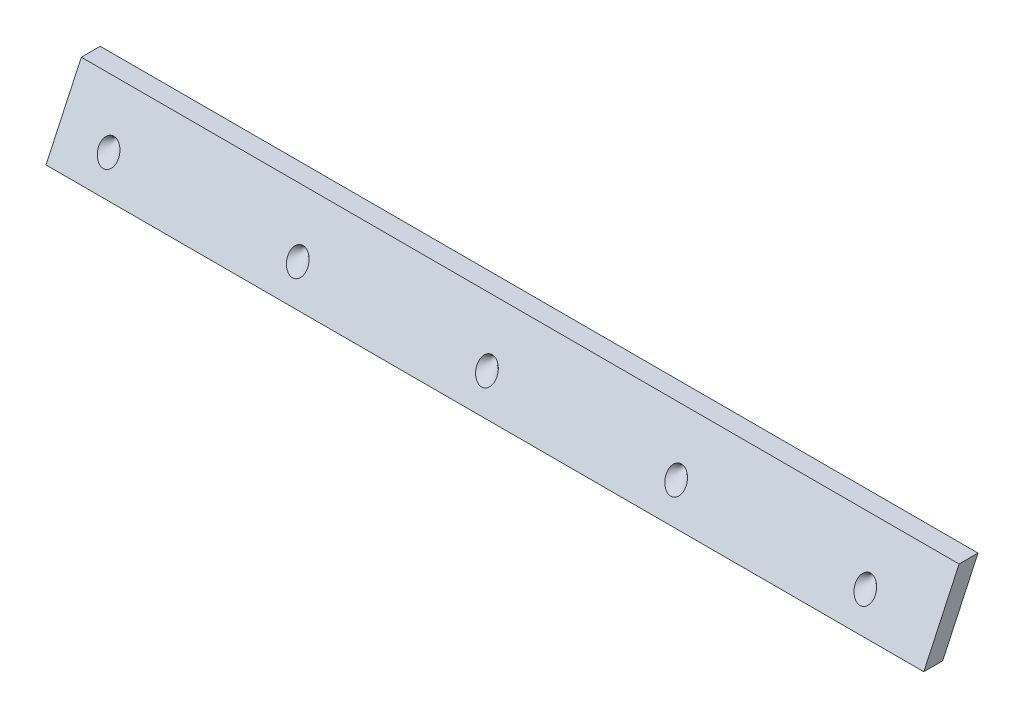
ISO-10303-21;
HEADER;
FILE_DESCRIPTION(('STEP AP214'),'2;1');
FILE_NAME('part.step','',(''),(''),'','','');
FILE_SCHEMA(('AUTOMOTIVE_DESIGN { 1 0 10303 214 1 1 1 1 }'));
ENDSEC;
DATA;
#1=APPLICATION_CONTEXT('core data for automotive mechanical design processes');
#2=APPLICATION_PROTOCOL_DEFINITION('international standard','automotive_design',2000,#1);
#3=PRODUCT_CONTEXT('',#1,'mechanical');
#4=PRODUCT('Part','Part','',(#3));
#5=PRODUCT_RELATED_PRODUCT_CATEGORY('part','',(#4));
#6=PRODUCT_DEFINITION_FORMATION('','',#4);
#7=PRODUCT_DEFINITION_CONTEXT('part definition',#1,'design');
#8=PRODUCT_DEFINITION('design','',#6,#7);
#9=PRODUCT_DEFINITION_SHAPE('','',#8);
#10=(LENGTH_UNIT() NAMED_UNIT(*) SI_UNIT(.MILLI.,.METRE.));
#11=(NAMED_UNIT(*) PLANE_ANGLE_UNIT() SI_UNIT($,.RADIAN.));
#12=(NAMED_UNIT(*) SI_UNIT($,.STERADIAN.) SOLID_ANGLE_UNIT());
#13=UNCERTAINTY_MEASURE_WITH_UNIT(LENGTH_MEASURE(1.E-05),#10,'distance_accuracy_value','');
#14=(GEOMETRIC_REPRESENTATION_CONTEXT(3) GLOBAL_UNCERTAINTY_ASSIGNED_CONTEXT((#13)) GLOBAL_UNIT_ASSIGNED_CONTEXT((#10,
#11,#12)) REPRESENTATION_CONTEXT('',''));
#15=CARTESIAN_POINT('',(0.,0.,0.));
#16=DIRECTION('',(0.,0.,1.));
#17=DIRECTION('',(1.,0.,0.));
#18=AXIS2_PLACEMENT_3D('',#15,#16,#17);
#19=CARTESIAN_POINT('',(116.,0.,5.));
#20=DIRECTION('',(0.,0.422618261740697,0.906307787036651));
#21=DIRECTION('',(0.,-0.906307787036651,0.422618261740697));
#22=AXIS2_PLACEMENT_3D('',#19,#20,#21);
#23=PLANE('',#22);
#24=CARTESIAN_POINT('',(47.,7.60107702553502,1.45555957276703));
#25=DIRECTION('',(0.,0.422618261740697,0.906307787036651));
#26=DIRECTION('',(0.,-0.906307787036651,0.422618261740697));
#27=AXIS2_PLACEMENT_3D('',#24,#25,#26);
#28=ELLIPSE('',#27,3.31013375688748,2.65386783987336);
#29=CARTESIAN_POINT('',(47.,4.60107702553501,2.85448254723202));
#30=VERTEX_POINT('',#29);
#31=EDGE_CURVE('E161',#30,#30,#28,.F.);
#32=ORIENTED_EDGE('',*,*,#31,.T.);
#33=EDGE_LOOP('',(#32));
#34=FACE_BOUND('',#33,.T.);
#35=CARTESIAN_POINT('',(-53.,7.60107702553502,1.45555957276703));
#36=DIRECTION('',(0.,0.422618261740697,0.906307787036651));
#37=DIRECTION('',(0.,-0.906307787036651,0.422618261740697));
#38=AXIS2_PLACEMENT_3D('',#35,#36,#37);
#39=ELLIPSE('',#38,3.31013375688748,2.65386783987336);
#40=CARTESIAN_POINT('',(-53.,4.60107702553501,2.85448254723202));
#41=VERTEX_POINT('',#40);
#42=EDGE_CURVE('E160',#41,#41,#39,.F.);
#43=ORIENTED_EDGE('',*,*,#42,.T.);
#44=EDGE_LOOP('',(#43));
#45=FACE_BOUND('',#44,.T.);
#46=DIRECTION('',(0.,0.906307787036651,-0.422618261740697));
#47=VECTOR('',#46,1.);
#48=CARTESIAN_POINT('',(-116.,0.,5.));
#49=LINE('',#48,#47);
#50=CARTESIAN_POINT('',(-116.,0.,5.));
#51=VERTEX_POINT('',#50);
#52=CARTESIAN_POINT('',(-116.,20.,-4.32615316309991));
#53=VERTEX_POINT('',#52);
#54=EDGE_CURVE('E190',#51,#53,#49,.T.);
#55=ORIENTED_EDGE('',*,*,#54,.F.);
#56=DIRECTION('',(-1.,0.,0.));
#57=VECTOR('',#56,1.);
#58=CARTESIAN_POINT('',(116.,0.,5.));
#59=LINE('',#58,#57);
#60=CARTESIAN_POINT('',(116.,0.,5.));
#61=VERTEX_POINT('',#60);
#62=EDGE_CURVE('E89',#61,#51,#59,.T.);
#63=ORIENTED_EDGE('',*,*,#62,.F.);
#64=DIRECTION('',(0.,0.906307787036651,-0.422618261740697));
#65=VECTOR('',#64,1.);
#66=CARTESIAN_POINT('',(116.,0.,5.));
#67=LINE('',#66,#65);
#68=CARTESIAN_POINT('',(116.,20.,-4.32615316309991));
#69=VERTEX_POINT('',#68);
#70=EDGE_CURVE('E202',#61,#69,#67,.T.);
#71=ORIENTED_EDGE('',*,*,#70,.T.);
#72=DIRECTION('',(-1.,0.,0.));
#73=VECTOR('',#72,1.);
#74=CARTESIAN_POINT('',(116.,20.,-4.32615316309991));
#75=LINE('',#74,#73);
#76=EDGE_CURVE('E177',#69,#53,#75,.T.);
#77=ORIENTED_EDGE('',*,*,#76,.T.);
#78=EDGE_LOOP('',(#55,#63,#71,#77));
#79=FACE_BOUND('',#78,.T.);
#80=CARTESIAN_POINT('',(-103.,7.60107702553502,1.45555957276703));
#81=DIRECTION('',(0.,0.422618261740697,0.906307787036651));
#82=DIRECTION('',(0.,-0.906307787036651,0.422618261740697));
#83=AXIS2_PLACEMENT_3D('',#80,#81,#82);
#84=ELLIPSE('',#83,3.31013375688748,2.65386783987336);
#85=CARTESIAN_POINT('',(-103.,4.60107702553501,2.85448254723202));
#86=VERTEX_POINT('',#85);
#87=EDGE_CURVE('E168',#86,#86,#84,.F.);
#88=ORIENTED_EDGE('',*,*,#87,.T.);
#89=EDGE_LOOP('',(#88));
#90=FACE_BOUND('',#89,.T.);
#91=CARTESIAN_POINT('',(-3.,7.60107702553502,1.45555957276703));
#92=DIRECTION('',(0.,0.422618261740697,0.906307787036651));
#93=DIRECTION('',(0.,-0.906307787036651,0.422618261740697));
#94=AXIS2_PLACEMENT_3D('',#91,#92,#93);
#95=ELLIPSE('',#94,3.31013375688748,2.65386783987336);
#96=CARTESIAN_POINT('',(-3.,4.60107702553501,2.85448254723202));
#97=VERTEX_POINT('',#96);
#98=EDGE_CURVE('E157',#97,#97,#95,.F.);
#99=ORIENTED_EDGE('',*,*,#98,.T.);
#100=EDGE_LOOP('',(#99));
#101=FACE_BOUND('',#100,.T.);
#102=CARTESIAN_POINT('',(97.,7.60107702553502,1.45555957276703));
#103=DIRECTION('',(0.,0.422618261740697,0.906307787036651));
#104=DIRECTION('',(0.,-0.906307787036651,0.422618261740697));
#105=AXIS2_PLACEMENT_3D('',#102,#103,#104);
#106=ELLIPSE('',#105,3.31013375688748,2.65386783987336);
#107=CARTESIAN_POINT('',(97.,4.60107702553501,2.85448254723202));
#108=VERTEX_POINT('',#107);
#109=EDGE_CURVE('E49',#108,#108,#106,.F.);
#110=ORIENTED_EDGE('',*,*,#109,.T.);
#111=EDGE_LOOP('',(#110));
#112=FACE_BOUND('',#111,.T.);
#113=ADVANCED_FACE('F45',(#34,#45,#79,#90,#101,#112),#23,.T.);
#114=CARTESIAN_POINT('',(116.,0.,0.));
#115=DIRECTION('',(0.,-1.,0.));
#116=DIRECTION('',(0.,0.,-1.));
#117=AXIS2_PLACEMENT_3D('',#114,#115,#116);
#118=PLANE('',#117);
#119=DIRECTION('',(0.,0.,1.));
#120=VECTOR('',#119,1.);
#121=CARTESIAN_POINT('',(-116.,0.,0.));
#122=LINE('',#121,#120);
#123=CARTESIAN_POINT('',(-116.,0.,0.));
#124=VERTEX_POINT('',#123);
#125=EDGE_CURVE('E174',#124,#51,#122,.T.);
#126=ORIENTED_EDGE('',*,*,#125,.F.);
#127=DIRECTION('',(-1.,0.,0.));
#128=VECTOR('',#127,1.);
#129=CARTESIAN_POINT('',(116.,0.,0.));
#130=LINE('',#129,#128);
#131=CARTESIAN_POINT('',(116.,0.,0.));
#132=VERTEX_POINT('',#131);
#133=EDGE_CURVE('E11',#132,#124,#130,.T.);
#134=ORIENTED_EDGE('',*,*,#133,.F.);
#135=DIRECTION('',(0.,0.,1.));
#136=VECTOR('',#135,1.);
#137=CARTESIAN_POINT('',(116.,0.,0.));
#138=LINE('',#137,#136);
#139=EDGE_CURVE('E185',#132,#61,#138,.T.);
#140=ORIENTED_EDGE('',*,*,#139,.T.);
#141=ORIENTED_EDGE('',*,*,#62,.T.);
#142=EDGE_LOOP('',(#126,#134,#140,#141));
#143=FACE_BOUND('',#142,.T.);
#144=ADVANCED_FACE('F47',(#143),#118,.T.);
#145=CARTESIAN_POINT('',(116.,0.,0.));
#146=DIRECTION('',(0.,0.422618261740697,0.906307787036651));
#147=DIRECTION('',(0.,-0.906307787036651,0.422618261740697));
#148=AXIS2_PLACEMENT_3D('',#145,#146,#147);
#149=PLANE('',#148);
#150=DIRECTION('',(0.,0.906307787036651,-0.422618261740697));
#151=VECTOR('',#150,1.);
#152=CARTESIAN_POINT('',(-116.,0.,0.));
#153=LINE('',#152,#151);
#154=CARTESIAN_POINT('',(-116.,20.,-9.32615316309991));
#155=VERTEX_POINT('',#154);
#156=EDGE_CURVE('E81',#124,#155,#153,.T.);
#157=ORIENTED_EDGE('',*,*,#156,.T.);
#158=DIRECTION('',(-1.,0.,0.));
#159=VECTOR('',#158,1.);
#160=CARTESIAN_POINT('',(116.,20.,-9.32615316309991));
#161=LINE('',#160,#159);
#162=CARTESIAN_POINT('',(116.,20.,-9.32615316309991));
#163=VERTEX_POINT('',#162);
#164=EDGE_CURVE('E56',#163,#155,#161,.T.);
#165=ORIENTED_EDGE('',*,*,#164,.F.);
#166=DIRECTION('',(0.,0.906307787036651,-0.422618261740697));
#167=VECTOR('',#166,1.);
#168=CARTESIAN_POINT('',(116.,0.,0.));
#169=LINE('',#168,#167);
#170=EDGE_CURVE('E178',#132,#163,#169,.T.);
#171=ORIENTED_EDGE('',*,*,#170,.F.);
#172=ORIENTED_EDGE('',*,*,#133,.T.);
#173=EDGE_LOOP('',(#157,#165,#171,#172));
#174=FACE_BOUND('',#173,.T.);
#175=ADVANCED_FACE('F124',(#174),#149,.F.);
#176=CARTESIAN_POINT('',(116.,20.,-9.32615316309991));
#177=DIRECTION('',(0.,-1.,0.));
#178=DIRECTION('',(0.,0.,-1.));
#179=AXIS2_PLACEMENT_3D('',#176,#177,#178);
#180=PLANE('',#179);
#181=DIRECTION('',(0.,0.,1.));
#182=VECTOR('',#181,1.);
#183=CARTESIAN_POINT('',(-116.,20.,-9.32615316309991));
#184=LINE('',#183,#182);
#185=EDGE_CURVE('E186',#155,#53,#184,.T.);
#186=ORIENTED_EDGE('',*,*,#185,.T.);
#187=ORIENTED_EDGE('',*,*,#76,.F.);
#188=DIRECTION('',(0.,0.,1.));
#189=VECTOR('',#188,1.);
#190=CARTESIAN_POINT('',(116.,20.,-9.32615316309991));
#191=LINE('',#190,#189);
#192=EDGE_CURVE('E199',#163,#69,#191,.T.);
#193=ORIENTED_EDGE('',*,*,#192,.F.);
#194=ORIENTED_EDGE('',*,*,#164,.T.);
#195=EDGE_LOOP('',(#186,#187,#193,#194));
#196=FACE_BOUND('',#195,.T.);
#197=ADVANCED_FACE('F128',(#196),#180,.F.);
#198=CARTESIAN_POINT('',(116.,0.,0.));
#199=DIRECTION('',(-1.,0.,0.));
#200=DIRECTION('',(0.,0.,1.));
#201=AXIS2_PLACEMENT_3D('',#198,#199,#200);
#202=PLANE('',#201);
#203=ORIENTED_EDGE('',*,*,#139,.F.);
#204=ORIENTED_EDGE('',*,*,#170,.T.);
#205=ORIENTED_EDGE('',*,*,#192,.T.);
#206=ORIENTED_EDGE('',*,*,#70,.F.);
#207=EDGE_LOOP('',(#203,#204,#205,#206));
#208=FACE_BOUND('',#207,.T.);
#209=ADVANCED_FACE('F131',(#208),#202,.F.);
#210=CARTESIAN_POINT('',(-116.,0.,0.));
#211=DIRECTION('',(-1.,0.,0.));
#212=DIRECTION('',(0.,0.,1.));
#213=AXIS2_PLACEMENT_3D('',#210,#211,#212);
#214=PLANE('',#213);
#215=ORIENTED_EDGE('',*,*,#125,.T.);
#216=ORIENTED_EDGE('',*,*,#54,.T.);
#217=ORIENTED_EDGE('',*,*,#185,.F.);
#218=ORIENTED_EDGE('',*,*,#156,.F.);
#219=EDGE_LOOP('',(#215,#216,#217,#218));
#220=FACE_BOUND('',#219,.T.);
#221=ADVANCED_FACE('F135',(#220),#214,.T.);
#222=CARTESIAN_POINT('',(-103.,9.,-1.54444042723299));
#223=DIRECTION('',(0.,0.,1.));
#224=DIRECTION('',(0.,-1.,0.));
#225=AXIS2_PLACEMENT_3D('',#222,#223,#224);
#226=CONICAL_SURFACE('',#225,0.,0.785398163397446);
#227=ORIENTED_EDGE('',*,*,#87,.F.);
#228=EDGE_LOOP('',(#227));
#229=FACE_BOUND('',#228,.T.);
#230=CARTESIAN_POINT('',(-103.,9.,-1.54444042723299));
#231=VERTEX_POINT('',#230);
#232=VERTEX_LOOP('',#231);
#233=FACE_BOUND('',#232,.T.);
#234=ADVANCED_FACE('F138',(#229,#233),#226,.F.);
#235=CARTESIAN_POINT('',(-53.,9.,-1.54444042723299));
#236=DIRECTION('',(0.,0.,1.));
#237=DIRECTION('',(0.,-1.,0.));
#238=AXIS2_PLACEMENT_3D('',#235,#236,#237);
#239=CONICAL_SURFACE('',#238,0.,0.785398163397446);
#240=ORIENTED_EDGE('',*,*,#42,.F.);
#241=EDGE_LOOP('',(#240));
#242=FACE_BOUND('',#241,.T.);
#243=CARTESIAN_POINT('',(-53.,9.,-1.54444042723299));
#244=VERTEX_POINT('',#243);
#245=VERTEX_LOOP('',#244);
#246=FACE_BOUND('',#245,.T.);
#247=ADVANCED_FACE('F145',(#242,#246),#239,.F.);
#248=CARTESIAN_POINT('',(-3.,9.,-1.54444042723299));
#249=DIRECTION('',(0.,0.,1.));
#250=DIRECTION('',(0.,-1.,0.));
#251=AXIS2_PLACEMENT_3D('',#248,#249,#250);
#252=CONICAL_SURFACE('',#251,0.,0.785398163397446);
#253=ORIENTED_EDGE('',*,*,#98,.F.);
#254=EDGE_LOOP('',(#253));
#255=FACE_BOUND('',#254,.T.);
#256=CARTESIAN_POINT('',(-3.,9.,-1.54444042723299));
#257=VERTEX_POINT('',#256);
#258=VERTEX_LOOP('',#257);
#259=FACE_BOUND('',#258,.T.);
#260=ADVANCED_FACE('F115',(#255,#259),#252,.F.);
#261=CARTESIAN_POINT('',(47.,9.,-1.54444042723299));
#262=DIRECTION('',(0.,0.,1.));
#263=DIRECTION('',(0.,-1.,0.));
#264=AXIS2_PLACEMENT_3D('',#261,#262,#263);
#265=CONICAL_SURFACE('',#264,0.,0.785398163397446);
#266=ORIENTED_EDGE('',*,*,#31,.F.);
#267=EDGE_LOOP('',(#266));
#268=FACE_BOUND('',#267,.T.);
#269=CARTESIAN_POINT('',(47.,9.,-1.54444042723299));
#270=VERTEX_POINT('',#269);
#271=VERTEX_LOOP('',#270);
#272=FACE_BOUND('',#271,.T.);
#273=ADVANCED_FACE('F109',(#268,#272),#265,.F.);
#274=CARTESIAN_POINT('',(97.,9.,-1.54444042723299));
#275=DIRECTION('',(0.,0.,1.));
#276=DIRECTION('',(0.,-1.,0.));
#277=AXIS2_PLACEMENT_3D('',#274,#275,#276);
#278=CONICAL_SURFACE('',#277,0.,0.785398163397446);
#279=ORIENTED_EDGE('',*,*,#109,.F.);
#280=EDGE_LOOP('',(#279));
#281=FACE_BOUND('',#280,.T.);
#282=CARTESIAN_POINT('',(97.,9.,-1.54444042723299));
#283=VERTEX_POINT('',#282);
#284=VERTEX_LOOP('',#283);
#285=FACE_BOUND('',#284,.T.);
#286=ADVANCED_FACE('F107',(#281,#285),#278,.F.);
#287=CLOSED_SHELL('',(#113,#144,#175,#197,#209,#221,#234,#247,#260,#273,#286));
#288=MANIFOLD_SOLID_BREP('B2',#287);
#289=ADVANCED_BREP_SHAPE_REPRESENTATION('',(#18,#288),#14);
#290=SHAPE_DEFINITION_REPRESENTATION(#9,#289);
ENDSEC;
END-ISO-10303-21;
